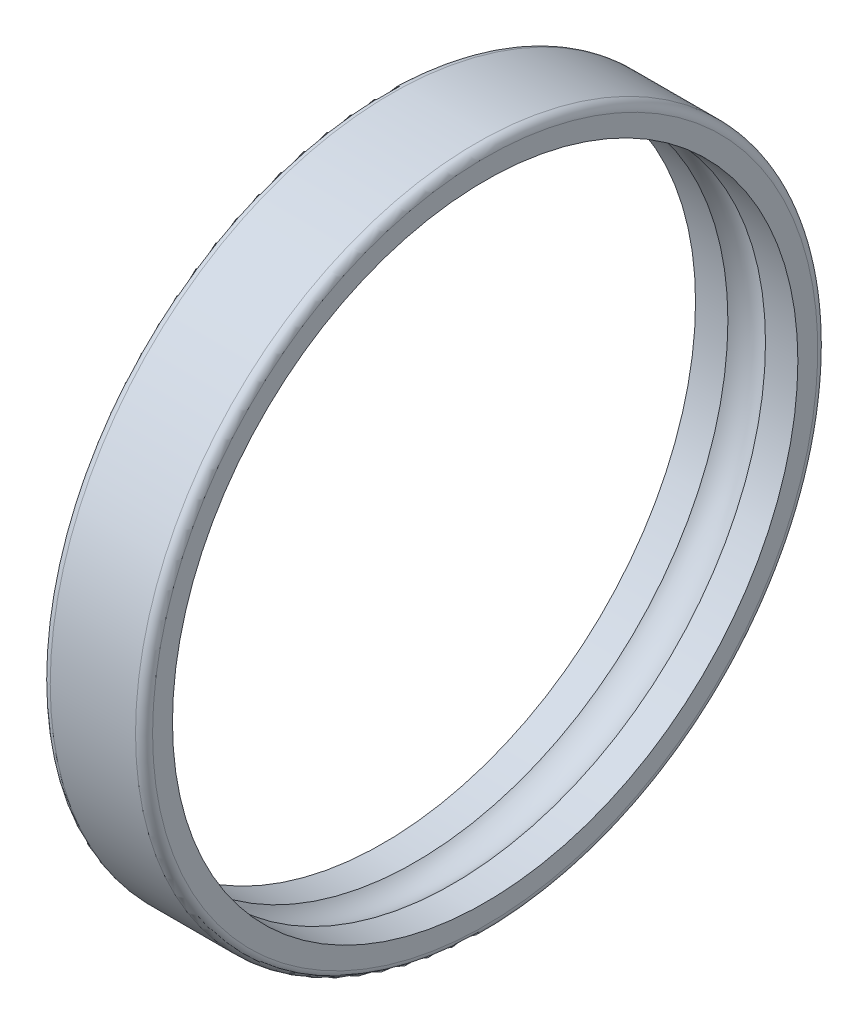
ISO-10303-21;
HEADER;
FILE_DESCRIPTION(('STEP AP214'),'2;1');
FILE_NAME('part.step','',(''),(''),'','','');
FILE_SCHEMA(('AUTOMOTIVE_DESIGN { 1 0 10303 214 1 1 1 1 }'));
ENDSEC;
DATA;
#1=APPLICATION_CONTEXT('core data for automotive mechanical design processes');
#2=APPLICATION_PROTOCOL_DEFINITION('international standard','automotive_design',2000,#1);
#3=PRODUCT_CONTEXT('',#1,'mechanical');
#4=PRODUCT('Part','Part','',(#3));
#5=PRODUCT_RELATED_PRODUCT_CATEGORY('part','',(#4));
#6=PRODUCT_DEFINITION_FORMATION('','',#4);
#7=PRODUCT_DEFINITION_CONTEXT('part definition',#1,'design');
#8=PRODUCT_DEFINITION('design','',#6,#7);
#9=PRODUCT_DEFINITION_SHAPE('','',#8);
#10=(LENGTH_UNIT() NAMED_UNIT(*) SI_UNIT(.MILLI.,.METRE.));
#11=(NAMED_UNIT(*) PLANE_ANGLE_UNIT() SI_UNIT($,.RADIAN.));
#12=(NAMED_UNIT(*) SI_UNIT($,.STERADIAN.) SOLID_ANGLE_UNIT());
#13=UNCERTAINTY_MEASURE_WITH_UNIT(LENGTH_MEASURE(1.E-05),#10,'distance_accuracy_value','');
#14=(GEOMETRIC_REPRESENTATION_CONTEXT(3) GLOBAL_UNCERTAINTY_ASSIGNED_CONTEXT((#13)) GLOBAL_UNIT_ASSIGNED_CONTEXT((#10,
#11,#12)) REPRESENTATION_CONTEXT('',''));
#15=CARTESIAN_POINT('',(0.,0.,0.));
#16=DIRECTION('',(0.,0.,1.));
#17=DIRECTION('',(1.,0.,0.));
#18=AXIS2_PLACEMENT_3D('',#15,#16,#17);
#19=CARTESIAN_POINT('',(-7.78743781094526,0.,0.));
#20=DIRECTION('',(-1.,0.,0.));
#21=DIRECTION('',(0.,0.,1.));
#22=AXIS2_PLACEMENT_3D('',#19,#20,#21);
#23=CYLINDRICAL_SURFACE('',#22,55.);
#24=CARTESIAN_POINT('',(5.69281086116926,0.,0.));
#25=DIRECTION('',(-1.,0.,0.));
#26=DIRECTION('',(0.,0.,1.));
#27=AXIS2_PLACEMENT_3D('',#24,#25,#26);
#28=CIRCLE('',#27,55.);
#29=CARTESIAN_POINT('',(5.69281086116926,0.,55.));
#30=VERTEX_POINT('',#29);
#31=EDGE_CURVE('E59',#30,#30,#28,.T.);
#32=ORIENTED_EDGE('',*,*,#31,.F.);
#33=EDGE_LOOP('',(#32));
#34=FACE_BOUND('',#33,.T.);
#35=CARTESIAN_POINT('',(0.,0.,0.));
#36=DIRECTION('',(-1.,0.,0.));
#37=DIRECTION('',(0.,0.,1.));
#38=AXIS2_PLACEMENT_3D('',#35,#36,#37);
#39=CIRCLE('',#38,55.);
#40=CARTESIAN_POINT('',(0.,0.,55.));
#41=VERTEX_POINT('',#40);
#42=EDGE_CURVE('E10',#41,#41,#39,.T.);
#43=ORIENTED_EDGE('',*,*,#42,.T.);
#44=EDGE_LOOP('',(#43));
#45=FACE_BOUND('',#44,.T.);
#46=ADVANCED_FACE('F31',(#34,#45),#23,.F.);
#47=CARTESIAN_POINT('',(0.,58.5,0.));
#48=DIRECTION('',(1.,0.,0.));
#49=DIRECTION('',(0.,0.,-1.));
#50=AXIS2_PLACEMENT_3D('',#47,#48,#49);
#51=PLANE('',#50);
#52=ORIENTED_EDGE('',*,*,#42,.F.);
#53=EDGE_LOOP('',(#52));
#54=FACE_BOUND('',#53,.T.);
#55=CARTESIAN_POINT('',(0.,0.,0.));
#56=DIRECTION('',(-1.,0.,0.));
#57=DIRECTION('',(0.,0.,1.));
#58=AXIS2_PLACEMENT_3D('',#55,#56,#57);
#59=CIRCLE('',#58,58.5);
#60=CARTESIAN_POINT('',(0.,0.,58.5));
#61=VERTEX_POINT('',#60);
#62=EDGE_CURVE('E37',#61,#61,#59,.T.);
#63=ORIENTED_EDGE('',*,*,#62,.T.);
#64=EDGE_LOOP('',(#63));
#65=FACE_BOUND('',#64,.T.);
#66=ADVANCED_FACE('F66',(#54,#65),#51,.F.);
#67=CARTESIAN_POINT('',(1.5,0.,0.));
#68=DIRECTION('',(-1.,0.,0.));
#69=DIRECTION('',(0.,0.,1.));
#70=AXIS2_PLACEMENT_3D('',#67,#68,#69);
#71=TOROIDAL_SURFACE('',#70,58.5,1.5);
#72=ORIENTED_EDGE('',*,*,#62,.F.);
#73=EDGE_LOOP('',(#72));
#74=FACE_BOUND('',#73,.T.);
#75=CARTESIAN_POINT('',(1.50000000000001,0.,0.));
#76=DIRECTION('',(-1.,0.,0.));
#77=DIRECTION('',(0.,0.,1.));
#78=AXIS2_PLACEMENT_3D('',#75,#76,#77);
#79=CIRCLE('',#78,60.);
#80=CARTESIAN_POINT('',(1.50000000000001,0.,60.));
#81=VERTEX_POINT('',#80);
#82=EDGE_CURVE('E41',#81,#81,#79,.T.);
#83=ORIENTED_EDGE('',*,*,#82,.T.);
#84=EDGE_LOOP('',(#83));
#85=FACE_BOUND('',#84,.T.);
#86=ADVANCED_FACE('F70',(#74,#85),#71,.T.);
#87=CARTESIAN_POINT('',(-7.78743781094526,0.,0.));
#88=DIRECTION('',(-1.,0.,0.));
#89=DIRECTION('',(0.,0.,1.));
#90=AXIS2_PLACEMENT_3D('',#87,#88,#89);
#91=CYLINDRICAL_SURFACE('',#90,60.);
#92=ORIENTED_EDGE('',*,*,#82,.F.);
#93=EDGE_LOOP('',(#92));
#94=FACE_BOUND('',#93,.T.);
#95=CARTESIAN_POINT('',(16.5,0.,0.));
#96=DIRECTION('',(-1.,0.,0.));
#97=DIRECTION('',(0.,0.,1.));
#98=AXIS2_PLACEMENT_3D('',#95,#96,#97);
#99=CIRCLE('',#98,60.);
#100=CARTESIAN_POINT('',(16.5,0.,60.));
#101=VERTEX_POINT('',#100);
#102=EDGE_CURVE('E45',#101,#101,#99,.T.);
#103=ORIENTED_EDGE('',*,*,#102,.T.);
#104=EDGE_LOOP('',(#103));
#105=FACE_BOUND('',#104,.T.);
#106=ADVANCED_FACE('F75',(#94,#105),#91,.T.);
#107=CARTESIAN_POINT('',(16.5,0.,0.));
#108=DIRECTION('',(-1.,0.,0.));
#109=DIRECTION('',(0.,0.,1.));
#110=AXIS2_PLACEMENT_3D('',#107,#108,#109);
#111=TOROIDAL_SURFACE('',#110,58.5,1.5);
#112=ORIENTED_EDGE('',*,*,#102,.F.);
#113=EDGE_LOOP('',(#112));
#114=FACE_BOUND('',#113,.T.);
#115=CARTESIAN_POINT('',(18.,0.,0.));
#116=DIRECTION('',(-1.,0.,0.));
#117=DIRECTION('',(0.,0.,1.));
#118=AXIS2_PLACEMENT_3D('',#115,#116,#117);
#119=CIRCLE('',#118,58.5);
#120=CARTESIAN_POINT('',(18.,0.,58.5));
#121=VERTEX_POINT('',#120);
#122=EDGE_CURVE('E50',#121,#121,#119,.T.);
#123=ORIENTED_EDGE('',*,*,#122,.T.);
#124=EDGE_LOOP('',(#123));
#125=FACE_BOUND('',#124,.T.);
#126=ADVANCED_FACE('F81',(#114,#125),#111,.T.);
#127=CARTESIAN_POINT('',(18.,58.5,0.));
#128=DIRECTION('',(-1.,0.,0.));
#129=DIRECTION('',(0.,0.,1.));
#130=AXIS2_PLACEMENT_3D('',#127,#128,#129);
#131=PLANE('',#130);
#132=ORIENTED_EDGE('',*,*,#122,.F.);
#133=EDGE_LOOP('',(#132));
#134=FACE_BOUND('',#133,.T.);
#135=CARTESIAN_POINT('',(18.,0.,0.));
#136=DIRECTION('',(-1.,0.,0.));
#137=DIRECTION('',(0.,0.,1.));
#138=AXIS2_PLACEMENT_3D('',#135,#136,#137);
#139=CIRCLE('',#138,55.);
#140=CARTESIAN_POINT('',(18.,0.,55.));
#141=VERTEX_POINT('',#140);
#142=EDGE_CURVE('E53',#141,#141,#139,.T.);
#143=ORIENTED_EDGE('',*,*,#142,.T.);
#144=EDGE_LOOP('',(#143));
#145=FACE_BOUND('',#144,.T.);
#146=ADVANCED_FACE('F85',(#134,#145),#131,.F.);
#147=CARTESIAN_POINT('',(-7.78743781094526,0.,0.));
#148=DIRECTION('',(-1.,0.,0.));
#149=DIRECTION('',(0.,0.,1.));
#150=AXIS2_PLACEMENT_3D('',#147,#148,#149);
#151=CYLINDRICAL_SURFACE('',#150,55.);
#152=ORIENTED_EDGE('',*,*,#142,.F.);
#153=EDGE_LOOP('',(#152));
#154=FACE_BOUND('',#153,.T.);
#155=CARTESIAN_POINT('',(12.3071891388308,0.,0.));
#156=DIRECTION('',(-1.,0.,0.));
#157=DIRECTION('',(0.,0.,1.));
#158=AXIS2_PLACEMENT_3D('',#155,#156,#157);
#159=CIRCLE('',#158,55.);
#160=CARTESIAN_POINT('',(12.3071891388308,0.,55.));
#161=VERTEX_POINT('',#160);
#162=EDGE_CURVE('E56',#161,#161,#159,.T.);
#163=ORIENTED_EDGE('',*,*,#162,.T.);
#164=EDGE_LOOP('',(#163));
#165=FACE_BOUND('',#164,.T.);
#166=ADVANCED_FACE('F89',(#154,#165),#151,.F.);
#167=CARTESIAN_POINT('',(9.,0.,0.));
#168=DIRECTION('',(-1.,0.,0.));
#169=DIRECTION('',(0.,0.,1.));
#170=AXIS2_PLACEMENT_3D('',#167,#168,#169);
#171=TOROIDAL_SURFACE('',#170,51.25,4.99999999999999);
#172=ORIENTED_EDGE('',*,*,#162,.F.);
#173=EDGE_LOOP('',(#172));
#174=FACE_BOUND('',#173,.T.);
#175=ORIENTED_EDGE('',*,*,#31,.T.);
#176=EDGE_LOOP('',(#175));
#177=FACE_BOUND('',#176,.T.);
#178=ADVANCED_FACE('F63',(#174,#177),#171,.F.);
#179=CLOSED_SHELL('',(#46,#66,#86,#106,#126,#146,#166,#178));
#180=MANIFOLD_SOLID_BREP('B2',#179);
#181=ADVANCED_BREP_SHAPE_REPRESENTATION('',(#18,#180),#14);
#182=SHAPE_DEFINITION_REPRESENTATION(#9,#181);
ENDSEC;
END-ISO-10303-21;
